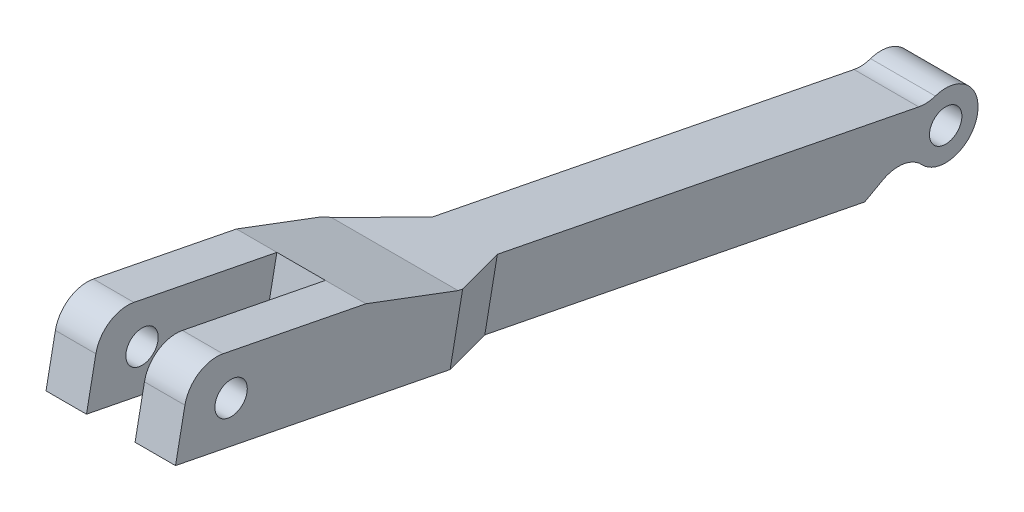
ISO-10303-21;
HEADER;
FILE_DESCRIPTION(('STEP AP214'),'2;1');
FILE_NAME('part.step','',(''),(''),'','','');
FILE_SCHEMA(('AUTOMOTIVE_DESIGN { 1 0 10303 214 1 1 1 1 }'));
ENDSEC;
DATA;
#1=APPLICATION_CONTEXT('core data for automotive mechanical design processes');
#2=APPLICATION_PROTOCOL_DEFINITION('international standard','automotive_design',2000,#1);
#3=PRODUCT_CONTEXT('',#1,'mechanical');
#4=PRODUCT('Part','Part','',(#3));
#5=PRODUCT_RELATED_PRODUCT_CATEGORY('part','',(#4));
#6=PRODUCT_DEFINITION_FORMATION('','',#4);
#7=PRODUCT_DEFINITION_CONTEXT('part definition',#1,'design');
#8=PRODUCT_DEFINITION('design','',#6,#7);
#9=PRODUCT_DEFINITION_SHAPE('','',#8);
#10=(LENGTH_UNIT() NAMED_UNIT(*) SI_UNIT(.MILLI.,.METRE.));
#11=(NAMED_UNIT(*) PLANE_ANGLE_UNIT() SI_UNIT($,.RADIAN.));
#12=(NAMED_UNIT(*) SI_UNIT($,.STERADIAN.) SOLID_ANGLE_UNIT());
#13=UNCERTAINTY_MEASURE_WITH_UNIT(LENGTH_MEASURE(1.E-05),#10,'distance_accuracy_value','');
#14=(GEOMETRIC_REPRESENTATION_CONTEXT(3) GLOBAL_UNCERTAINTY_ASSIGNED_CONTEXT((#13)) GLOBAL_UNIT_ASSIGNED_CONTEXT((#10,
#11,#12)) REPRESENTATION_CONTEXT('',''));
#15=CARTESIAN_POINT('',(0.,0.,0.));
#16=DIRECTION('',(0.,0.,1.));
#17=DIRECTION('',(1.,0.,0.));
#18=AXIS2_PLACEMENT_3D('',#15,#16,#17);
#19=CARTESIAN_POINT('',(-2.,8.08511513449856,41.0452945472443));
#20=DIRECTION('',(0.,0.193266508732252,0.981146297247483));
#21=DIRECTION('',(0.,-0.981146297247483,0.193266508732252));
#22=AXIS2_PLACEMENT_3D('',#19,#20,#21);
#23=PLANE('',#22);
#24=DIRECTION('',(1.,0.,0.));
#25=VECTOR('',#24,1.);
#26=CARTESIAN_POINT('',(-2.,7.79094786220222,41.1032397098154));
#27=LINE('',#26,#25);
#28=CARTESIAN_POINT('',(-2.,7.79094786220222,41.1032397098154));
#29=VERTEX_POINT('',#28);
#30=CARTESIAN_POINT('',(1.,7.79094786220221,41.1032397098154));
#31=VERTEX_POINT('',#30);
#32=EDGE_CURVE('E302',#29,#31,#27,.T.);
#33=ORIENTED_EDGE('',*,*,#32,.T.);
#34=DIRECTION('',(0.,0.981146297247483,-0.193266508732252));
#35=VECTOR('',#34,1.);
#36=CARTESIAN_POINT('',(1.,8.08511513449856,41.0452945472443));
#37=LINE('',#36,#35);
#38=CARTESIAN_POINT('',(1.,12.6966793484396,40.1369071661542));
#39=VERTEX_POINT('',#38);
#40=EDGE_CURVE('E194',#31,#39,#37,.T.);
#41=ORIENTED_EDGE('',*,*,#40,.T.);
#42=DIRECTION('',(1.,0.,0.));
#43=VECTOR('',#42,1.);
#44=CARTESIAN_POINT('',(-2.,12.6966793484396,40.1369071661542));
#45=LINE('',#44,#43);
#46=CARTESIAN_POINT('',(-2.,12.6966793484396,40.1369071661542));
#47=VERTEX_POINT('',#46);
#48=EDGE_CURVE('E193',#47,#39,#45,.T.);
#49=ORIENTED_EDGE('',*,*,#48,.F.);
#50=DIRECTION('',(0.,-0.981146297247483,0.193266508732252));
#51=VECTOR('',#50,1.);
#52=CARTESIAN_POINT('',(-2.,8.08511513449856,41.0452945472443));
#53=LINE('',#52,#51);
#54=EDGE_CURVE('E275',#47,#29,#53,.T.);
#55=ORIENTED_EDGE('',*,*,#54,.T.);
#56=EDGE_LOOP('',(#33,#41,#49,#55));
#57=FACE_BOUND('',#56,.T.);
#58=ADVANCED_FACE('F39',(#57),#23,.T.);
#59=CARTESIAN_POINT('',(-2.,0.,0.));
#60=DIRECTION('',(1.,0.,0.));
#61=DIRECTION('',(0.,0.,-1.));
#62=AXIS2_PLACEMENT_3D('',#59,#60,#61);
#63=PLANE('',#62);
#64=CARTESIAN_POINT('',(-2.,2.82842712474617,2.82842712474621));
#65=DIRECTION('',(1.,0.,0.));
#66=DIRECTION('',(0.,0.,-1.));
#67=AXIS2_PLACEMENT_3D('',#64,#65,#66);
#68=CIRCLE('',#67,1.);
#69=CARTESIAN_POINT('',(-2.,2.82842712474617,1.82842712474621));
#70=VERTEX_POINT('',#69);
#71=EDGE_CURVE('E289',#70,#70,#68,.T.);
#72=ORIENTED_EDGE('',*,*,#71,.T.);
#73=EDGE_LOOP('',(#72));
#74=FACE_BOUND('',#73,.T.);
#75=DIRECTION('',(0.,0.193266508732253,0.981146297247483));
#76=VECTOR('',#75,1.);
#77=CARTESIAN_POINT('',(-2.,-0.294167272296387,0.0579451625710739));
#78=LINE('',#77,#76);
#79=CARTESIAN_POINT('',(-2.,1.23646472846601,7.8284271247462));
#80=VERTEX_POINT('',#79);
#81=CARTESIAN_POINT('',(-2.,5.8582827748797,31.2917767373406));
#82=VERTEX_POINT('',#81);
#83=EDGE_CURVE('E278',#80,#82,#78,.T.);
#84=ORIENTED_EDGE('',*,*,#83,.T.);
#85=DIRECTION('',(0.,0.981146297247483,-0.193266508732253));
#86=VECTOR('',#85,1.);
#87=CARTESIAN_POINT('',(-2.,9.78286796386962,30.5187107024116));
#88=LINE('',#87,#86);
#89=CARTESIAN_POINT('',(-2.,9.78286796386963,30.5187107024116));
#90=VERTEX_POINT('',#89);
#91=EDGE_CURVE('E322',#82,#90,#88,.T.);
#92=ORIENTED_EDGE('',*,*,#91,.T.);
#93=DIRECTION('',(0.,0.193266508732253,0.981146297247483));
#94=VECTOR('',#93,1.);
#95=CARTESIAN_POINT('',(-2.,3.63041791669355,-0.715120872357937));
#96=LINE('',#95,#94);
#97=CARTESIAN_POINT('',(-2.,4.65637088782305,4.49328261863853));
#98=VERTEX_POINT('',#97);
#99=EDGE_CURVE('E272',#98,#90,#96,.T.);
#100=ORIENTED_EDGE('',*,*,#99,.F.);
#101=CARTESIAN_POINT('',(-2.,6.61866348231801,4.10674960117403));
#102=DIRECTION('',(1.,0.,0.));
#103=DIRECTION('',(0.,0.,-1.));
#104=AXIS2_PLACEMENT_3D('',#101,#102,#103);
#105=CIRCLE('',#104,2.);
#106=CARTESIAN_POINT('',(-2.,4.72354530353209,3.46758836296012));
#107=VERTEX_POINT('',#106);
#108=EDGE_CURVE('E270',#98,#107,#105,.T.);
#109=ORIENTED_EDGE('',*,*,#108,.T.);
#110=CARTESIAN_POINT('',(-2.,2.82842712474617,2.82842712474621));
#111=DIRECTION('',(1.,0.,0.));
#112=DIRECTION('',(0.,0.,-1.));
#113=AXIS2_PLACEMENT_3D('',#110,#111,#112);
#114=CIRCLE('',#113,2.);
#115=CARTESIAN_POINT('',(-2.,1.46299909190755,4.28979849682739));
#116=VERTEX_POINT('',#115);
#117=EDGE_CURVE('E286',#116,#107,#114,.T.);
#118=ORIENTED_EDGE('',*,*,#117,.F.);
#119=CARTESIAN_POINT('',(-2.,0.0975710590689317,5.75116986890858));
#120=DIRECTION('',(1.,0.,0.));
#121=DIRECTION('',(0.,0.,-1.));
#122=AXIS2_PLACEMENT_3D('',#119,#120,#121);
#123=CIRCLE('',#122,2.);
#124=CARTESIAN_POINT('',(-2.,1.84923303121626,6.71640576511889));
#125=VERTEX_POINT('',#124);
#126=EDGE_CURVE('E284',#116,#125,#123,.T.);
#127=ORIENTED_EDGE('',*,*,#126,.T.);
#128=DIRECTION('',(0.,0.482617948105155,-0.875830986073666));
#129=VECTOR('',#128,1.);
#130=CARTESIAN_POINT('',(-2.,4.25747884786671,2.3460413462532));
#131=LINE('',#130,#129);
#132=EDGE_CURVE('E281',#80,#125,#131,.T.);
#133=ORIENTED_EDGE('',*,*,#132,.F.);
#134=EDGE_LOOP('',(#84,#92,#100,#109,#118,#127,#133));
#135=FACE_BOUND('',#134,.T.);
#136=ADVANCED_FACE('F378',(#74,#135),#63,.F.);
#137=CARTESIAN_POINT('',(-2.,6.61866348231801,4.10674960117403));
#138=DIRECTION('',(1.,0.,0.));
#139=DIRECTION('',(0.,0.,-1.));
#140=AXIS2_PLACEMENT_3D('',#137,#138,#139);
#141=CYLINDRICAL_SURFACE('',#140,2.);
#142=DIRECTION('',(1.,0.,0.));
#143=VECTOR('',#142,1.);
#144=CARTESIAN_POINT('',(-2.,4.65637088782305,4.49328261863853));
#145=LINE('',#144,#143);
#146=CARTESIAN_POINT('',(2.,4.65637088782305,4.49328261863853));
#147=VERTEX_POINT('',#146);
#148=EDGE_CURVE('E292',#98,#147,#145,.T.);
#149=ORIENTED_EDGE('',*,*,#148,.T.);
#150=CARTESIAN_POINT('',(2.,6.61866348231801,4.10674960117403));
#151=DIRECTION('',(1.,0.,0.));
#152=DIRECTION('',(0.,0.,-1.));
#153=AXIS2_PLACEMENT_3D('',#150,#151,#152);
#154=CIRCLE('',#153,2.);
#155=CARTESIAN_POINT('',(2.,4.72354530353209,3.46758836296012));
#156=VERTEX_POINT('',#155);
#157=EDGE_CURVE('E248',#147,#156,#154,.T.);
#158=ORIENTED_EDGE('',*,*,#157,.T.);
#159=DIRECTION('',(1.,0.,0.));
#160=VECTOR('',#159,1.);
#161=CARTESIAN_POINT('',(-2.,4.72354530353209,3.46758836296012));
#162=LINE('',#161,#160);
#163=EDGE_CURVE('E293',#107,#156,#162,.T.);
#164=ORIENTED_EDGE('',*,*,#163,.F.);
#165=ORIENTED_EDGE('',*,*,#108,.F.);
#166=EDGE_LOOP('',(#149,#158,#164,#165));
#167=FACE_BOUND('',#166,.T.);
#168=ADVANCED_FACE('F387',(#167),#141,.F.);
#169=CARTESIAN_POINT('',(-2.,2.82842712474617,2.82842712474621));
#170=DIRECTION('',(1.,0.,0.));
#171=DIRECTION('',(0.,0.,-1.));
#172=AXIS2_PLACEMENT_3D('',#169,#170,#171);
#173=CYLINDRICAL_SURFACE('',#172,2.);
#174=ORIENTED_EDGE('',*,*,#163,.T.);
#175=CARTESIAN_POINT('',(2.,2.82842712474617,2.82842712474621));
#176=DIRECTION('',(1.,0.,0.));
#177=DIRECTION('',(0.,0.,-1.));
#178=AXIS2_PLACEMENT_3D('',#175,#176,#177);
#179=CIRCLE('',#178,2.);
#180=CARTESIAN_POINT('',(2.,1.46299909190755,4.28979849682739));
#181=VERTEX_POINT('',#180);
#182=EDGE_CURVE('E264',#181,#156,#179,.T.);
#183=ORIENTED_EDGE('',*,*,#182,.F.);
#184=DIRECTION('',(1.,0.,0.));
#185=VECTOR('',#184,1.);
#186=CARTESIAN_POINT('',(-2.,1.46299909190755,4.28979849682739));
#187=LINE('',#186,#185);
#188=EDGE_CURVE('E296',#116,#181,#187,.T.);
#189=ORIENTED_EDGE('',*,*,#188,.F.);
#190=ORIENTED_EDGE('',*,*,#117,.T.);
#191=EDGE_LOOP('',(#174,#183,#189,#190));
#192=FACE_BOUND('',#191,.T.);
#193=ADVANCED_FACE('F392',(#192),#173,.T.);
#194=CARTESIAN_POINT('',(-2.,0.0975710590689317,5.75116986890858));
#195=DIRECTION('',(1.,0.,0.));
#196=DIRECTION('',(0.,0.,-1.));
#197=AXIS2_PLACEMENT_3D('',#194,#195,#196);
#198=CYLINDRICAL_SURFACE('',#197,2.);
#199=ORIENTED_EDGE('',*,*,#188,.T.);
#200=CARTESIAN_POINT('',(2.,0.0975710590689317,5.75116986890858));
#201=DIRECTION('',(1.,0.,0.));
#202=DIRECTION('',(0.,0.,-1.));
#203=AXIS2_PLACEMENT_3D('',#200,#201,#202);
#204=CIRCLE('',#203,2.);
#205=CARTESIAN_POINT('',(2.,1.84923303121626,6.71640576511889));
#206=VERTEX_POINT('',#205);
#207=EDGE_CURVE('E261',#181,#206,#204,.T.);
#208=ORIENTED_EDGE('',*,*,#207,.T.);
#209=DIRECTION('',(1.,0.,0.));
#210=VECTOR('',#209,1.);
#211=CARTESIAN_POINT('',(-2.,1.84923303121626,6.71640576511889));
#212=LINE('',#211,#210);
#213=EDGE_CURVE('E298',#125,#206,#212,.T.);
#214=ORIENTED_EDGE('',*,*,#213,.F.);
#215=ORIENTED_EDGE('',*,*,#126,.F.);
#216=EDGE_LOOP('',(#199,#208,#214,#215));
#217=FACE_BOUND('',#216,.T.);
#218=ADVANCED_FACE('F396',(#217),#198,.F.);
#219=CARTESIAN_POINT('',(-2.,4.25747884786671,2.3460413462532));
#220=DIRECTION('',(0.,-0.875830986073666,-0.482617948105156));
#221=DIRECTION('',(0.,0.482617948105156,-0.875830986073666));
#222=AXIS2_PLACEMENT_3D('',#219,#220,#221);
#223=PLANE('',#222);
#224=ORIENTED_EDGE('',*,*,#213,.T.);
#225=DIRECTION('',(0.,0.482617948105155,-0.875830986073666));
#226=VECTOR('',#225,1.);
#227=CARTESIAN_POINT('',(2.,4.25747884786671,2.3460413462532));
#228=LINE('',#227,#226);
#229=CARTESIAN_POINT('',(2.,1.23646472846601,7.8284271247462));
#230=VERTEX_POINT('',#229);
#231=EDGE_CURVE('E258',#230,#206,#228,.T.);
#232=ORIENTED_EDGE('',*,*,#231,.F.);
#233=DIRECTION('',(1.,0.,0.));
#234=VECTOR('',#233,1.);
#235=CARTESIAN_POINT('',(-2.,1.23646472846601,7.8284271247462));
#236=LINE('',#235,#234);
#237=EDGE_CURVE('E300',#80,#230,#236,.T.);
#238=ORIENTED_EDGE('',*,*,#237,.F.);
#239=ORIENTED_EDGE('',*,*,#132,.T.);
#240=EDGE_LOOP('',(#224,#232,#238,#239));
#241=FACE_BOUND('',#240,.T.);
#242=ADVANCED_FACE('F399',(#241),#223,.T.);
#243=CARTESIAN_POINT('',(-2.,-0.294167272296387,0.0579451625710739));
#244=DIRECTION('',(0.,0.981146297247483,-0.193266508732253));
#245=DIRECTION('',(0.,0.193266508732253,0.981146297247483));
#246=AXIS2_PLACEMENT_3D('',#243,#244,#245);
#247=PLANE('',#246);
#248=DIRECTION('',(0.,0.193266508732253,0.981146297247483));
#249=VECTOR('',#248,1.);
#250=CARTESIAN_POINT('',(-4.5,-0.294167272296385,0.0579451625710736));
#251=LINE('',#250,#249);
#252=CARTESIAN_POINT('',(-4.5,6.74484577395358,35.7925462163559));
#253=VERTEX_POINT('',#252);
#254=CARTESIAN_POINT('',(-4.5,9.916879458257,51.8958489795377));
#255=VERTEX_POINT('',#254);
#256=EDGE_CURVE('E227',#253,#255,#251,.T.);
#257=ORIENTED_EDGE('',*,*,#256,.F.);
#258=CARTESIAN_POINT('',(-3.5,6.74484577395358,35.7925462163559));
#259=DIRECTION('',(0.,0.981146297247483,-0.193266508732253));
#260=DIRECTION('',(0.,0.193266508732253,0.981146297247483));
#261=AXIS2_PLACEMENT_3D('',#258,#259,#260);
#262=CIRCLE('',#261,1.);
#263=CARTESIAN_POINT('',(-4.30940107675851,6.6313488098087,35.2163619263305));
#264=VERTEX_POINT('',#263);
#265=EDGE_CURVE('E332',#253,#264,#262,.F.);
#266=ORIENTED_EDGE('',*,*,#265,.T.);
#267=DIRECTION('',(-0.500000000000004,0.167373706262857,0.849697618245356));
#268=VECTOR('',#267,1.);
#269=CARTESIAN_POINT('',(11.7845353323757,1.24394523949766,7.8664030562636));
#270=LINE('',#269,#268);
#271=EDGE_CURVE('E324',#264,#82,#270,.F.);
#272=ORIENTED_EDGE('',*,*,#271,.T.);
#273=ORIENTED_EDGE('',*,*,#83,.F.);
#274=ORIENTED_EDGE('',*,*,#237,.T.);
#275=DIRECTION('',(0.,0.193266508732253,0.981146297247483));
#276=VECTOR('',#275,1.);
#277=CARTESIAN_POINT('',(2.,-0.294167272296387,0.0579451625710739));
#278=LINE('',#277,#276);
#279=CARTESIAN_POINT('',(2.,5.85828277487969,31.2917767373406));
#280=VERTEX_POINT('',#279);
#281=EDGE_CURVE('E255',#230,#280,#278,.T.);
#282=ORIENTED_EDGE('',*,*,#281,.T.);
#283=DIRECTION('',(-0.374606593415919,-0.179193586525035,-0.909703005775849));
#284=VECTOR('',#283,1.);
#285=CARTESIAN_POINT('',(-9.61820488524957,0.300698260986606,3.07786888949747));
#286=LINE('',#285,#284);
#287=CARTESIAN_POINT('',(3.5,6.57580986733297,34.9344101897335));
#288=VERTEX_POINT('',#287);
#289=EDGE_CURVE('E315',#280,#288,#286,.F.);
#290=ORIENTED_EDGE('',*,*,#289,.T.);
#291=DIRECTION('',(0.,0.193266508732253,0.981146297247483));
#292=VECTOR('',#291,1.);
#293=CARTESIAN_POINT('',(3.5,-0.294167272296385,0.0579451625710736));
#294=LINE('',#293,#292);
#295=CARTESIAN_POINT('',(3.5,9.916879458257,51.8958489795377));
#296=VERTEX_POINT('',#295);
#297=EDGE_CURVE('E201',#288,#296,#294,.T.);
#298=ORIENTED_EDGE('',*,*,#297,.T.);
#299=DIRECTION('',(-1.,0.,0.));
#300=VECTOR('',#299,1.);
#301=CARTESIAN_POINT('',(3.5,9.916879458257,51.8958489795377));
#302=LINE('',#301,#300);
#303=CARTESIAN_POINT('',(1.,9.916879458257,51.8958489795377));
#304=VERTEX_POINT('',#303);
#305=EDGE_CURVE('E195',#296,#304,#302,.T.);
#306=ORIENTED_EDGE('',*,*,#305,.T.);
#307=DIRECTION('',(0.,0.193266508732253,0.981146297247483));
#308=VECTOR('',#307,1.);
#309=CARTESIAN_POINT('',(1.,-0.294167272296385,0.0579451625710736));
#310=LINE('',#309,#308);
#311=EDGE_CURVE('E213',#31,#304,#310,.T.);
#312=ORIENTED_EDGE('',*,*,#311,.F.);
#313=ORIENTED_EDGE('',*,*,#32,.F.);
#314=DIRECTION('',(0.,0.193266508732253,0.981146297247483));
#315=VECTOR('',#314,1.);
#316=CARTESIAN_POINT('',(-2.,-0.294167272296385,0.0579451625710736));
#317=LINE('',#316,#315);
#318=CARTESIAN_POINT('',(-2.,9.916879458257,51.8958489795377));
#319=VERTEX_POINT('',#318);
#320=EDGE_CURVE('E240',#29,#319,#317,.T.);
#321=ORIENTED_EDGE('',*,*,#320,.T.);
#322=DIRECTION('',(1.,0.,0.));
#323=VECTOR('',#322,1.);
#324=CARTESIAN_POINT('',(-4.5,9.916879458257,51.8958489795377));
#325=LINE('',#324,#323);
#326=EDGE_CURVE('E245',#255,#319,#325,.T.);
#327=ORIENTED_EDGE('',*,*,#326,.F.);
#328=EDGE_LOOP('',(#257,#266,#272,#273,#274,#282,#290,#298,#306,#312,#313,#321,#327));
#329=FACE_BOUND('',#328,.T.);
#330=ADVANCED_FACE('F369',(#329),#247,.F.);
#331=CARTESIAN_POINT('',(-2.,-2.09785580361169,0.788774441928198));
#332=DIRECTION('',(0.,-0.936023927679699,0.351936367559634));
#333=DIRECTION('',(0.,-0.351936367559634,-0.936023927679699));
#334=AXIS2_PLACEMENT_3D('',#331,#332,#333);
#335=PLANE('',#334);
#336=DIRECTION('',(1.,0.,0.));
#337=VECTOR('',#336,1.);
#338=CARTESIAN_POINT('',(-2.,10.5559339987986,34.4432958914015));
#339=LINE('',#338,#337);
#340=CARTESIAN_POINT('',(-4.30940107675851,10.5559339987986,34.4432958914015));
#341=VERTEX_POINT('',#340);
#342=CARTESIAN_POINT('',(3.5,10.5559339987986,34.4432958914015));
#343=VERTEX_POINT('',#342);
#344=EDGE_CURVE('E306',#341,#343,#339,.T.);
#345=ORIENTED_EDGE('',*,*,#344,.F.);
#346=CARTESIAN_POINT('',(-3.5,10.7654616779477,35.0005640207361));
#347=DIRECTION('',(0.,-0.936023927679699,0.351936367559634));
#348=DIRECTION('',(0.,-0.351936367559634,-0.936023927679699));
#349=AXIS2_PLACEMENT_3D('',#346,#347,#348);
#350=ELLIPSE('',#349,1.0137937550497,1.);
#351=CARTESIAN_POINT('',(-4.5,10.7654616779477,35.0005640207361));
#352=VERTEX_POINT('',#351);
#353=EDGE_CURVE('E334',#341,#352,#350,.F.);
#354=ORIENTED_EDGE('',*,*,#353,.T.);
#355=DIRECTION('',(0.,-0.351936367559634,-0.936023927679699));
#356=VECTOR('',#355,1.);
#357=CARTESIAN_POINT('',(-4.5,-2.09785580361169,0.788774441928198));
#358=LINE('',#357,#356);
#359=CARTESIAN_POINT('',(-4.5,12.6966793484396,40.1369071661542));
#360=VERTEX_POINT('',#359);
#361=EDGE_CURVE('E230',#360,#352,#358,.T.);
#362=ORIENTED_EDGE('',*,*,#361,.F.);
#363=DIRECTION('',(1.,0.,0.));
#364=VECTOR('',#363,1.);
#365=CARTESIAN_POINT('',(-4.5,12.6966793484396,40.1369071661542));
#366=LINE('',#365,#364);
#367=EDGE_CURVE('E237',#360,#47,#366,.T.);
#368=ORIENTED_EDGE('',*,*,#367,.T.);
#369=ORIENTED_EDGE('',*,*,#48,.T.);
#370=DIRECTION('',(-1.,0.,0.));
#371=VECTOR('',#370,1.);
#372=CARTESIAN_POINT('',(3.5,12.6966793484396,40.1369071661542));
#373=LINE('',#372,#371);
#374=CARTESIAN_POINT('',(3.5,12.6966793484396,40.1369071661542));
#375=VERTEX_POINT('',#374);
#376=EDGE_CURVE('E177',#375,#39,#373,.T.);
#377=ORIENTED_EDGE('',*,*,#376,.F.);
#378=DIRECTION('',(0.,-0.351936367559634,-0.936023927679699));
#379=VECTOR('',#378,1.);
#380=CARTESIAN_POINT('',(3.5,-2.09785580361169,0.788774441928198));
#381=LINE('',#380,#379);
#382=EDGE_CURVE('E185',#375,#343,#381,.T.);
#383=ORIENTED_EDGE('',*,*,#382,.T.);
#384=EDGE_LOOP('',(#345,#354,#362,#368,#369,#377,#383));
#385=FACE_BOUND('',#384,.T.);
#386=ADVANCED_FACE('F190',(#385),#335,.F.);
#387=CARTESIAN_POINT('',(-2.,3.63041791669355,-0.715120872357937));
#388=DIRECTION('',(0.,0.981146297247483,-0.193266508732253));
#389=DIRECTION('',(0.,0.193266508732253,0.981146297247483));
#390=AXIS2_PLACEMENT_3D('',#387,#388,#389);
#391=PLANE('',#390);
#392=ORIENTED_EDGE('',*,*,#344,.T.);
#393=DIRECTION('',(0.,-0.193266508732253,-0.981146297247483));
#394=VECTOR('',#393,1.);
#395=CARTESIAN_POINT('',(3.5,3.63041791669355,-0.715120872357937));
#396=LINE('',#395,#394);
#397=CARTESIAN_POINT('',(3.5,10.5003950563229,34.1613441548045));
#398=VERTEX_POINT('',#397);
#399=EDGE_CURVE('E200',#343,#398,#396,.T.);
#400=ORIENTED_EDGE('',*,*,#399,.T.);
#401=DIRECTION('',(0.374606593415919,0.179193586525035,0.909703005775849));
#402=VECTOR('',#401,1.);
#403=CARTESIAN_POINT('',(3.61610490334067,10.5559339987986,34.4432958914015));
#404=LINE('',#403,#402);
#405=CARTESIAN_POINT('',(2.,9.78286796386962,30.5187107024116));
#406=VERTEX_POINT('',#405);
#407=EDGE_CURVE('E313',#398,#406,#404,.F.);
#408=ORIENTED_EDGE('',*,*,#407,.T.);
#409=DIRECTION('',(0.,0.193266508732253,0.981146297247483));
#410=VECTOR('',#409,1.);
#411=CARTESIAN_POINT('',(2.,3.63041791669355,-0.715120872357937));
#412=LINE('',#411,#410);
#413=EDGE_CURVE('E252',#147,#406,#412,.T.);
#414=ORIENTED_EDGE('',*,*,#413,.F.);
#415=ORIENTED_EDGE('',*,*,#148,.F.);
#416=ORIENTED_EDGE('',*,*,#99,.T.);
#417=DIRECTION('',(0.500000000000004,-0.167373706262857,-0.849697618245356));
#418=VECTOR('',#417,1.);
#419=CARTESIAN_POINT('',(-4.30940107675851,10.5559339987986,34.4432958914015));
#420=LINE('',#419,#418);
#421=EDGE_CURVE('E326',#90,#341,#420,.F.);
#422=ORIENTED_EDGE('',*,*,#421,.T.);
#423=EDGE_LOOP('',(#392,#400,#408,#414,#415,#416,#422));
#424=FACE_BOUND('',#423,.T.);
#425=ADVANCED_FACE('F381',(#424),#391,.T.);
#426=CARTESIAN_POINT('',(-2.,2.82842712474617,2.82842712474621));
#427=DIRECTION('',(1.,0.,0.));
#428=DIRECTION('',(0.,0.,-1.));
#429=AXIS2_PLACEMENT_3D('',#426,#427,#428);
#430=CYLINDRICAL_SURFACE('',#429,1.);
#431=ORIENTED_EDGE('',*,*,#71,.F.);
#432=EDGE_LOOP('',(#431));
#433=FACE_BOUND('',#432,.T.);
#434=CARTESIAN_POINT('',(2.,2.82842712474617,2.82842712474621));
#435=DIRECTION('',(1.,0.,0.));
#436=DIRECTION('',(0.,0.,-1.));
#437=AXIS2_PLACEMENT_3D('',#434,#435,#436);
#438=CIRCLE('',#437,1.);
#439=CARTESIAN_POINT('',(2.,2.82842712474617,1.82842712474621));
#440=VERTEX_POINT('',#439);
#441=EDGE_CURVE('E267',#440,#440,#438,.T.);
#442=ORIENTED_EDGE('',*,*,#441,.T.);
#443=EDGE_LOOP('',(#442));
#444=FACE_BOUND('',#443,.T.);
#445=ADVANCED_FACE('F439',(#433,#444),#430,.F.);
#446=CARTESIAN_POINT('',(2.,0.,0.));
#447=DIRECTION('',(1.,0.,0.));
#448=DIRECTION('',(0.,0.,-1.));
#449=AXIS2_PLACEMENT_3D('',#446,#447,#448);
#450=PLANE('',#449);
#451=ORIENTED_EDGE('',*,*,#413,.T.);
#452=DIRECTION('',(0.,-0.981146297247483,0.193266508732253));
#453=VECTOR('',#452,1.);
#454=CARTESIAN_POINT('',(2.,5.85828277487969,31.2917767373406));
#455=LINE('',#454,#453);
#456=EDGE_CURVE('E295',#406,#280,#455,.T.);
#457=ORIENTED_EDGE('',*,*,#456,.T.);
#458=ORIENTED_EDGE('',*,*,#281,.F.);
#459=ORIENTED_EDGE('',*,*,#231,.T.);
#460=ORIENTED_EDGE('',*,*,#207,.F.);
#461=ORIENTED_EDGE('',*,*,#182,.T.);
#462=ORIENTED_EDGE('',*,*,#157,.F.);
#463=EDGE_LOOP('',(#451,#457,#458,#459,#460,#461,#462));
#464=FACE_BOUND('',#463,.T.);
#465=ORIENTED_EDGE('',*,*,#441,.F.);
#466=EDGE_LOOP('',(#465));
#467=FACE_BOUND('',#466,.T.);
#468=ADVANCED_FACE('F403',(#464,#467),#450,.T.);
#469=CARTESIAN_POINT('',(-2.,0.,0.));
#470=DIRECTION('',(1.,0.,0.));
#471=DIRECTION('',(0.,0.,-1.));
#472=AXIS2_PLACEMENT_3D('',#469,#470,#471);
#473=PLANE('',#472);
#474=CARTESIAN_POINT('',(-2.,11.8176930361465,48.4637781320032));
#475=DIRECTION('',(1.,0.,0.));
#476=DIRECTION('',(0.,0.,-1.));
#477=AXIS2_PLACEMENT_3D('',#474,#475,#476);
#478=CIRCLE('',#477,0.999999999999998);
#479=CARTESIAN_POINT('',(-2.,11.8176930361465,47.4637781320032));
#480=VERTEX_POINT('',#479);
#481=EDGE_CURVE('E223',#480,#480,#478,.T.);
#482=ORIENTED_EDGE('',*,*,#481,.F.);
#483=EDGE_LOOP('',(#482));
#484=FACE_BOUND('',#483,.T.);
#485=DIRECTION('',(0.,-0.193266508732252,-0.981146297247483));
#486=VECTOR('',#485,1.);
#487=CARTESIAN_POINT('',(-2.,4.61156421394105,-0.908387381090192));
#488=LINE('',#487,#486);
#489=CARTESIAN_POINT('',(-2.,14.4360779270299,48.9672238413815));
#490=VERTEX_POINT('',#489);
#491=EDGE_CURVE('E242',#490,#47,#488,.T.);
#492=ORIENTED_EDGE('',*,*,#491,.F.);
#493=CARTESIAN_POINT('',(-2.,12.4737853325349,49.353756858846));
#494=DIRECTION('',(1.,0.,0.));
#495=DIRECTION('',(0.,0.,-1.));
#496=AXIS2_PLACEMENT_3D('',#493,#494,#495);
#497=CIRCLE('',#496,2.);
#498=CARTESIAN_POINT('',(-2.,12.8603183499994,51.316049453341));
#499=VERTEX_POINT('',#498);
#500=EDGE_CURVE('E61',#490,#499,#497,.T.);
#501=ORIENTED_EDGE('',*,*,#500,.T.);
#502=DIRECTION('',(0.,0.981146297247483,-0.193266508732251));
#503=VECTOR('',#502,1.);
#504=CARTESIAN_POINT('',(-2.,10.2110467305533,51.8379038169667));
#505=LINE('',#504,#503);
#506=EDGE_CURVE('E228',#319,#499,#505,.T.);
#507=ORIENTED_EDGE('',*,*,#506,.F.);
#508=ORIENTED_EDGE('',*,*,#320,.F.);
#509=ORIENTED_EDGE('',*,*,#54,.F.);
#510=EDGE_LOOP('',(#492,#501,#507,#508,#509));
#511=FACE_BOUND('',#510,.T.);
#512=ADVANCED_FACE('F355',(#484,#511),#473,.T.);
#513=CARTESIAN_POINT('',(-4.5,10.2110467305533,51.8379038169667));
#514=DIRECTION('',(0.,-0.193266508732251,-0.981146297247483));
#515=DIRECTION('',(0.,0.981146297247483,-0.193266508732251));
#516=AXIS2_PLACEMENT_3D('',#513,#514,#515);
#517=PLANE('',#516);
#518=ORIENTED_EDGE('',*,*,#506,.T.);
#519=DIRECTION('',(1.,0.,0.));
#520=VECTOR('',#519,1.);
#521=CARTESIAN_POINT('',(-4.5,12.8603183499994,51.316049453341));
#522=LINE('',#521,#520);
#523=CARTESIAN_POINT('',(-4.5,12.8603183499994,51.316049453341));
#524=VERTEX_POINT('',#523);
#525=EDGE_CURVE('E47',#499,#524,#522,.F.);
#526=ORIENTED_EDGE('',*,*,#525,.T.);
#527=DIRECTION('',(0.,0.981146297247483,-0.193266508732251));
#528=VECTOR('',#527,1.);
#529=CARTESIAN_POINT('',(-4.5,10.2110467305533,51.8379038169667));
#530=LINE('',#529,#528);
#531=EDGE_CURVE('E235',#255,#524,#530,.T.);
#532=ORIENTED_EDGE('',*,*,#531,.F.);
#533=ORIENTED_EDGE('',*,*,#326,.T.);
#534=EDGE_LOOP('',(#518,#526,#532,#533));
#535=FACE_BOUND('',#534,.T.);
#536=ADVANCED_FACE('F418',(#535),#517,.F.);
#537=CARTESIAN_POINT('',(-4.5,4.61156421394105,-0.908387381090192));
#538=DIRECTION('',(0.,-0.981146297247483,0.193266508732252));
#539=DIRECTION('',(0.,-0.193266508732252,-0.981146297247483));
#540=AXIS2_PLACEMENT_3D('',#537,#538,#539);
#541=PLANE('',#540);
#542=DIRECTION('',(0.,-0.193266508732252,-0.981146297247483));
#543=VECTOR('',#542,1.);
#544=CARTESIAN_POINT('',(-4.5,4.61156421394105,-0.908387381090192));
#545=LINE('',#544,#543);
#546=CARTESIAN_POINT('',(-4.5,14.4360779270299,48.9672238413815));
#547=VERTEX_POINT('',#546);
#548=EDGE_CURVE('E233',#547,#360,#545,.T.);
#549=ORIENTED_EDGE('',*,*,#548,.F.);
#550=DIRECTION('',(1.,0.,0.));
#551=VECTOR('',#550,1.);
#552=CARTESIAN_POINT('',(-4.5,14.4360779270299,48.9672238413815));
#553=LINE('',#552,#551);
#554=EDGE_CURVE('E344',#547,#490,#553,.T.);
#555=ORIENTED_EDGE('',*,*,#554,.T.);
#556=ORIENTED_EDGE('',*,*,#491,.T.);
#557=ORIENTED_EDGE('',*,*,#367,.F.);
#558=EDGE_LOOP('',(#549,#555,#556,#557));
#559=FACE_BOUND('',#558,.T.);
#560=ADVANCED_FACE('F350',(#559),#541,.F.);
#561=CARTESIAN_POINT('',(-4.5,11.8176930361465,48.4637781320032));
#562=DIRECTION('',(1.,0.,0.));
#563=DIRECTION('',(0.,0.,-1.));
#564=AXIS2_PLACEMENT_3D('',#561,#562,#563);
#565=CYLINDRICAL_SURFACE('',#564,0.999999999999998);
#566=CARTESIAN_POINT('',(-4.5,11.8176930361465,48.4637781320032));
#567=DIRECTION('',(1.,0.,0.));
#568=DIRECTION('',(0.,0.,-1.));
#569=AXIS2_PLACEMENT_3D('',#566,#567,#568);
#570=CIRCLE('',#569,0.999999999999998);
#571=CARTESIAN_POINT('',(-4.5,11.8176930361465,47.4637781320032));
#572=VERTEX_POINT('',#571);
#573=EDGE_CURVE('E224',#572,#572,#570,.T.);
#574=ORIENTED_EDGE('',*,*,#573,.F.);
#575=EDGE_LOOP('',(#574));
#576=FACE_BOUND('',#575,.T.);
#577=ORIENTED_EDGE('',*,*,#481,.T.);
#578=EDGE_LOOP('',(#577));
#579=FACE_BOUND('',#578,.T.);
#580=ADVANCED_FACE('F554',(#576,#579),#565,.F.);
#581=CARTESIAN_POINT('',(-4.5,0.,0.));
#582=DIRECTION('',(1.,0.,0.));
#583=DIRECTION('',(0.,0.,-1.));
#584=AXIS2_PLACEMENT_3D('',#581,#582,#583);
#585=PLANE('',#584);
#586=ORIENTED_EDGE('',*,*,#573,.T.);
#587=EDGE_LOOP('',(#586));
#588=FACE_BOUND('',#587,.T.);
#589=ORIENTED_EDGE('',*,*,#531,.T.);
#590=CARTESIAN_POINT('',(-4.5,12.4737853325349,49.353756858846));
#591=DIRECTION('',(1.,0.,0.));
#592=DIRECTION('',(0.,0.,-1.));
#593=AXIS2_PLACEMENT_3D('',#590,#591,#592);
#594=CIRCLE('',#593,2.);
#595=EDGE_CURVE('E11',#524,#547,#594,.F.);
#596=ORIENTED_EDGE('',*,*,#595,.T.);
#597=ORIENTED_EDGE('',*,*,#548,.T.);
#598=ORIENTED_EDGE('',*,*,#361,.T.);
#599=DIRECTION('',(0.,-0.981146297247483,0.193266508732253));
#600=VECTOR('',#599,1.);
#601=CARTESIAN_POINT('',(-4.5,7.03901304624999,35.7346010537848));
#602=LINE('',#601,#600);
#603=EDGE_CURVE('E329',#352,#253,#602,.T.);
#604=ORIENTED_EDGE('',*,*,#603,.T.);
#605=ORIENTED_EDGE('',*,*,#256,.T.);
#606=EDGE_LOOP('',(#589,#596,#597,#598,#604,#605));
#607=FACE_BOUND('',#606,.T.);
#608=ADVANCED_FACE('F362',(#588,#607),#585,.F.);
#609=CARTESIAN_POINT('',(3.5,4.61156421394105,-0.908387381090192));
#610=DIRECTION('',(0.,0.981146297247483,-0.193266508732252));
#611=DIRECTION('',(0.,0.193266508732252,0.981146297247483));
#612=AXIS2_PLACEMENT_3D('',#609,#610,#611);
#613=PLANE('',#612);
#614=DIRECTION('',(0.,-0.193266508732252,-0.981146297247483));
#615=VECTOR('',#614,1.);
#616=CARTESIAN_POINT('',(1.,4.61156421394105,-0.908387381090192));
#617=LINE('',#616,#615);
#618=CARTESIAN_POINT('',(1.,14.4360779270299,48.9672238413815));
#619=VERTEX_POINT('',#618);
#620=EDGE_CURVE('E215',#619,#39,#617,.T.);
#621=ORIENTED_EDGE('',*,*,#620,.F.);
#622=DIRECTION('',(-1.,0.,0.));
#623=VECTOR('',#622,1.);
#624=CARTESIAN_POINT('',(3.5,14.4360779270299,48.9672238413815));
#625=LINE('',#624,#623);
#626=CARTESIAN_POINT('',(3.5,14.4360779270299,48.9672238413815));
#627=VERTEX_POINT('',#626);
#628=EDGE_CURVE('E180',#619,#627,#625,.F.);
#629=ORIENTED_EDGE('',*,*,#628,.T.);
#630=DIRECTION('',(0.,-0.193266508732252,-0.981146297247483));
#631=VECTOR('',#630,1.);
#632=CARTESIAN_POINT('',(3.5,4.61156421394105,-0.908387381090192));
#633=LINE('',#632,#631);
#634=EDGE_CURVE('E173',#627,#375,#633,.T.);
#635=ORIENTED_EDGE('',*,*,#634,.T.);
#636=ORIENTED_EDGE('',*,*,#376,.T.);
#637=EDGE_LOOP('',(#621,#629,#635,#636));
#638=FACE_BOUND('',#637,.T.);
#639=ADVANCED_FACE('F176',(#638),#613,.T.);
#640=CARTESIAN_POINT('',(3.5,11.8176930361465,48.4637781320032));
#641=DIRECTION('',(-1.,0.,0.));
#642=DIRECTION('',(0.,0.,1.));
#643=AXIS2_PLACEMENT_3D('',#640,#641,#642);
#644=CYLINDRICAL_SURFACE('',#643,0.999999999999998);
#645=CARTESIAN_POINT('',(3.5,11.8176930361465,48.4637781320032));
#646=DIRECTION('',(1.,0.,0.));
#647=DIRECTION('',(0.,0.,-1.));
#648=AXIS2_PLACEMENT_3D('',#645,#646,#647);
#649=CIRCLE('',#648,0.999999999999998);
#650=CARTESIAN_POINT('',(3.5,11.8176930361465,47.4637781320032));
#651=VERTEX_POINT('',#650);
#652=EDGE_CURVE('E204',#651,#651,#649,.T.);
#653=ORIENTED_EDGE('',*,*,#652,.T.);
#654=EDGE_LOOP('',(#653));
#655=FACE_BOUND('',#654,.T.);
#656=CARTESIAN_POINT('',(1.,11.8176930361465,48.4637781320032));
#657=DIRECTION('',(1.,0.,0.));
#658=DIRECTION('',(0.,0.,-1.));
#659=AXIS2_PLACEMENT_3D('',#656,#657,#658);
#660=CIRCLE('',#659,0.999999999999998);
#661=CARTESIAN_POINT('',(1.,11.8176930361465,47.4637781320032));
#662=VERTEX_POINT('',#661);
#663=EDGE_CURVE('E210',#662,#662,#660,.T.);
#664=ORIENTED_EDGE('',*,*,#663,.F.);
#665=EDGE_LOOP('',(#664));
#666=FACE_BOUND('',#665,.T.);
#667=ADVANCED_FACE('F531',(#655,#666),#644,.F.);
#668=CARTESIAN_POINT('',(3.5,10.2110467305533,51.8379038169667));
#669=DIRECTION('',(0.,0.193266508732251,0.981146297247483));
#670=DIRECTION('',(0.,-0.981146297247483,0.193266508732251));
#671=AXIS2_PLACEMENT_3D('',#668,#669,#670);
#672=PLANE('',#671);
#673=DIRECTION('',(0.,0.981146297247483,-0.193266508732251));
#674=VECTOR('',#673,1.);
#675=CARTESIAN_POINT('',(3.5,10.2110467305533,51.8379038169667));
#676=LINE('',#675,#674);
#677=CARTESIAN_POINT('',(3.5,12.8603183499994,51.316049453341));
#678=VERTEX_POINT('',#677);
#679=EDGE_CURVE('E184',#296,#678,#676,.T.);
#680=ORIENTED_EDGE('',*,*,#679,.T.);
#681=DIRECTION('',(-1.,0.,0.));
#682=VECTOR('',#681,1.);
#683=CARTESIAN_POINT('',(3.5,12.8603183499994,51.316049453341));
#684=LINE('',#683,#682);
#685=CARTESIAN_POINT('',(1.,12.8603183499994,51.316049453341));
#686=VERTEX_POINT('',#685);
#687=EDGE_CURVE('E336',#678,#686,#684,.T.);
#688=ORIENTED_EDGE('',*,*,#687,.T.);
#689=DIRECTION('',(0.,0.981146297247483,-0.193266508732251));
#690=VECTOR('',#689,1.);
#691=CARTESIAN_POINT('',(1.,10.2110467305533,51.8379038169667));
#692=LINE('',#691,#690);
#693=EDGE_CURVE('E217',#304,#686,#692,.T.);
#694=ORIENTED_EDGE('',*,*,#693,.F.);
#695=ORIENTED_EDGE('',*,*,#305,.F.);
#696=EDGE_LOOP('',(#680,#688,#694,#695));
#697=FACE_BOUND('',#696,.T.);
#698=ADVANCED_FACE('F413',(#697),#672,.T.);
#699=CARTESIAN_POINT('',(3.5,0.,0.));
#700=DIRECTION('',(1.,0.,0.));
#701=DIRECTION('',(0.,0.,-1.));
#702=AXIS2_PLACEMENT_3D('',#699,#700,#701);
#703=PLANE('',#702);
#704=ORIENTED_EDGE('',*,*,#652,.F.);
#705=EDGE_LOOP('',(#704));
#706=FACE_BOUND('',#705,.T.);
#707=ORIENTED_EDGE('',*,*,#634,.F.);
#708=CARTESIAN_POINT('',(3.5,12.4737853325349,49.353756858846));
#709=DIRECTION('',(1.,0.,0.));
#710=DIRECTION('',(0.,0.,-1.));
#711=AXIS2_PLACEMENT_3D('',#708,#709,#710);
#712=CIRCLE('',#711,2.);
#713=EDGE_CURVE('E342',#627,#678,#712,.T.);
#714=ORIENTED_EDGE('',*,*,#713,.T.);
#715=ORIENTED_EDGE('',*,*,#679,.F.);
#716=ORIENTED_EDGE('',*,*,#297,.F.);
#717=DIRECTION('',(0.,-0.981146297247483,0.193266508732253));
#718=VECTOR('',#717,1.);
#719=CARTESIAN_POINT('',(3.5,6.86997713962938,34.8764650271624));
#720=LINE('',#719,#718);
#721=EDGE_CURVE('E311',#288,#398,#720,.F.);
#722=ORIENTED_EDGE('',*,*,#721,.T.);
#723=ORIENTED_EDGE('',*,*,#399,.F.);
#724=ORIENTED_EDGE('',*,*,#382,.F.);
#725=EDGE_LOOP('',(#707,#714,#715,#716,#722,#723,#724));
#726=FACE_BOUND('',#725,.T.);
#727=ADVANCED_FACE('F198',(#706,#726),#703,.T.);
#728=CARTESIAN_POINT('',(1.,0.,0.));
#729=DIRECTION('',(1.,0.,0.));
#730=DIRECTION('',(0.,0.,-1.));
#731=AXIS2_PLACEMENT_3D('',#728,#729,#730);
#732=PLANE('',#731);
#733=ORIENTED_EDGE('',*,*,#693,.T.);
#734=CARTESIAN_POINT('',(1.,12.4737853325349,49.353756858846));
#735=DIRECTION('',(1.,0.,0.));
#736=DIRECTION('',(0.,0.,-1.));
#737=AXIS2_PLACEMENT_3D('',#734,#735,#736);
#738=CIRCLE('',#737,2.);
#739=EDGE_CURVE('E339',#686,#619,#738,.F.);
#740=ORIENTED_EDGE('',*,*,#739,.T.);
#741=ORIENTED_EDGE('',*,*,#620,.T.);
#742=ORIENTED_EDGE('',*,*,#40,.F.);
#743=ORIENTED_EDGE('',*,*,#311,.T.);
#744=EDGE_LOOP('',(#733,#740,#741,#742,#743));
#745=FACE_BOUND('',#744,.T.);
#746=ORIENTED_EDGE('',*,*,#663,.T.);
#747=EDGE_LOOP('',(#746));
#748=FACE_BOUND('',#747,.T.);
#749=ADVANCED_FACE('F416',(#745,#748),#732,.F.);
#750=CARTESIAN_POINT('',(3.61610490334067,6.92551608210511,35.1584167637595));
#751=DIRECTION('',(0.927183854566785,-0.0723989084575774,-0.367543872054522));
#752=DIRECTION('',(0.,-0.981146297247483,0.193266508732253));
#753=AXIS2_PLACEMENT_3D('',#750,#751,#752);
#754=PLANE('',#753);
#755=ORIENTED_EDGE('',*,*,#289,.F.);
#756=ORIENTED_EDGE('',*,*,#456,.F.);
#757=ORIENTED_EDGE('',*,*,#407,.F.);
#758=ORIENTED_EDGE('',*,*,#721,.F.);
#759=EDGE_LOOP('',(#755,#756,#757,#758));
#760=FACE_BOUND('',#759,.T.);
#761=ADVANCED_FACE('F408',(#760),#754,.T.);
#762=CARTESIAN_POINT('',(-4.30940107675851,6.92551608210511,35.1584167637595));
#763=DIRECTION('',(-0.866025403784436,-0.0966332543661275,-0.490573148623746));
#764=DIRECTION('',(0.,0.981146297247483,-0.193266508732253));
#765=AXIS2_PLACEMENT_3D('',#762,#763,#764);
#766=PLANE('',#765);
#767=ORIENTED_EDGE('',*,*,#421,.F.);
#768=ORIENTED_EDGE('',*,*,#91,.F.);
#769=ORIENTED_EDGE('',*,*,#271,.F.);
#770=DIRECTION('',(0.,-0.981146297247483,0.193266508732253));
#771=VECTOR('',#770,1.);
#772=CARTESIAN_POINT('',(-4.30940107675851,6.6313488098087,35.2163619263305));
#773=LINE('',#772,#771);
#774=EDGE_CURVE('E319',#341,#264,#773,.T.);
#775=ORIENTED_EDGE('',*,*,#774,.F.);
#776=EDGE_LOOP('',(#767,#768,#769,#775));
#777=FACE_BOUND('',#776,.T.);
#778=ADVANCED_FACE('F375',(#777),#766,.T.);
#779=CARTESIAN_POINT('',(-3.5,7.03901304624999,35.7346010537848));
#780=DIRECTION('',(0.,-0.981146297247483,0.193266508732253));
#781=DIRECTION('',(0.,-0.193266508732253,-0.981146297247483));
#782=AXIS2_PLACEMENT_3D('',#779,#780,#781);
#783=CYLINDRICAL_SURFACE('',#782,1.);
#784=ORIENTED_EDGE('',*,*,#353,.F.);
#785=ORIENTED_EDGE('',*,*,#774,.T.);
#786=ORIENTED_EDGE('',*,*,#265,.F.);
#787=ORIENTED_EDGE('',*,*,#603,.F.);
#788=EDGE_LOOP('',(#784,#785,#786,#787));
#789=FACE_BOUND('',#788,.T.);
#790=ADVANCED_FACE('F365',(#789),#783,.T.);
#791=CARTESIAN_POINT('',(3.5,12.4737853325349,49.353756858846));
#792=DIRECTION('',(-1.,0.,0.));
#793=DIRECTION('',(0.,0.,1.));
#794=AXIS2_PLACEMENT_3D('',#791,#792,#793);
#795=CYLINDRICAL_SURFACE('',#794,2.);
#796=ORIENTED_EDGE('',*,*,#713,.F.);
#797=ORIENTED_EDGE('',*,*,#628,.F.);
#798=ORIENTED_EDGE('',*,*,#739,.F.);
#799=ORIENTED_EDGE('',*,*,#687,.F.);
#800=EDGE_LOOP('',(#796,#797,#798,#799));
#801=FACE_BOUND('',#800,.T.);
#802=ADVANCED_FACE('F420',(#801),#795,.T.);
#803=CARTESIAN_POINT('',(-4.5,12.4737853325349,49.353756858846));
#804=DIRECTION('',(1.,0.,0.));
#805=DIRECTION('',(0.,0.,-1.));
#806=AXIS2_PLACEMENT_3D('',#803,#804,#805);
#807=CYLINDRICAL_SURFACE('',#806,2.);
#808=ORIENTED_EDGE('',*,*,#595,.F.);
#809=ORIENTED_EDGE('',*,*,#525,.F.);
#810=ORIENTED_EDGE('',*,*,#500,.F.);
#811=ORIENTED_EDGE('',*,*,#554,.F.);
#812=EDGE_LOOP('',(#808,#809,#810,#811));
#813=FACE_BOUND('',#812,.T.);
#814=ADVANCED_FACE('F41',(#813),#807,.T.);
#815=CLOSED_SHELL('',(#58,#136,#168,#193,#218,#242,#330,#386,#425,#445,#468,#512,#536,#560,#580,
#608,#639,#667,#698,#727,#749,#761,#778,#790,#802,#814));
#816=MANIFOLD_SOLID_BREP('B2',#815);
#817=ADVANCED_BREP_SHAPE_REPRESENTATION('',(#18,#816),#14);
#818=SHAPE_DEFINITION_REPRESENTATION(#9,#817);
ENDSEC;
END-ISO-10303-21;
